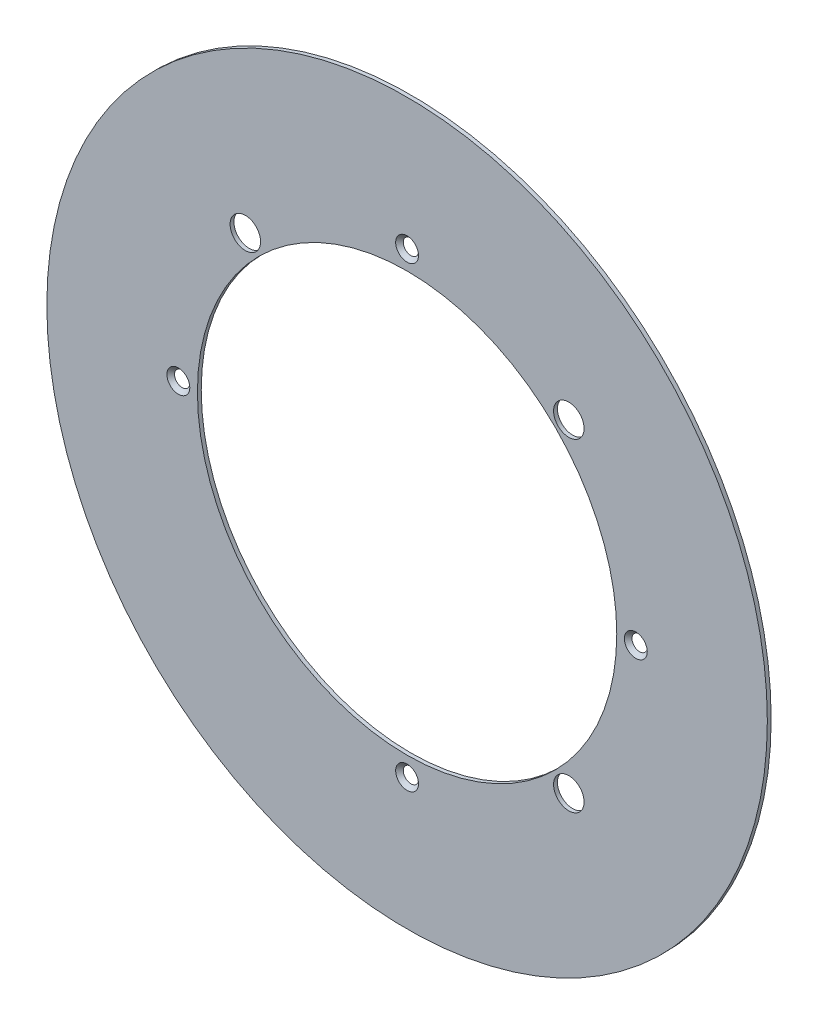
ISO-10303-21;
HEADER;
FILE_DESCRIPTION(('STEP AP214'),'2;1');
FILE_NAME('part.step','',(''),(''),'','','');
FILE_SCHEMA(('AUTOMOTIVE_DESIGN { 1 0 10303 214 1 1 1 1 }'));
ENDSEC;
DATA;
#1=APPLICATION_CONTEXT('core data for automotive mechanical design processes');
#2=APPLICATION_PROTOCOL_DEFINITION('international standard','automotive_design',2000,#1);
#3=PRODUCT_CONTEXT('',#1,'mechanical');
#4=PRODUCT('Part','Part','',(#3));
#5=PRODUCT_RELATED_PRODUCT_CATEGORY('part','',(#4));
#6=PRODUCT_DEFINITION_FORMATION('','',#4);
#7=PRODUCT_DEFINITION_CONTEXT('part definition',#1,'design');
#8=PRODUCT_DEFINITION('design','',#6,#7);
#9=PRODUCT_DEFINITION_SHAPE('','',#8);
#10=(LENGTH_UNIT() NAMED_UNIT(*) SI_UNIT(.MILLI.,.METRE.));
#11=(NAMED_UNIT(*) PLANE_ANGLE_UNIT() SI_UNIT($,.RADIAN.));
#12=(NAMED_UNIT(*) SI_UNIT($,.STERADIAN.) SOLID_ANGLE_UNIT());
#13=UNCERTAINTY_MEASURE_WITH_UNIT(LENGTH_MEASURE(1.E-05),#10,'distance_accuracy_value','');
#14=(GEOMETRIC_REPRESENTATION_CONTEXT(3) GLOBAL_UNCERTAINTY_ASSIGNED_CONTEXT((#13)) GLOBAL_UNIT_ASSIGNED_CONTEXT((#10,
#11,#12)) REPRESENTATION_CONTEXT('',''));
#15=CARTESIAN_POINT('',(0.,0.,0.));
#16=DIRECTION('',(0.,0.,1.));
#17=DIRECTION('',(1.,0.,0.));
#18=AXIS2_PLACEMENT_3D('',#15,#16,#17);
#19=CARTESIAN_POINT('',(0.,0.,1.));
#20=DIRECTION('',(0.,0.,1.));
#21=DIRECTION('',(1.,0.,0.));
#22=AXIS2_PLACEMENT_3D('',#19,#20,#21);
#23=PLANE('',#22);
#24=CARTESIAN_POINT('',(0.,60.,1.));
#25=DIRECTION('',(0.,0.,1.));
#26=DIRECTION('',(1.,0.,0.));
#27=AXIS2_PLACEMENT_3D('',#24,#25,#26);
#28=CIRCLE('',#27,3.);
#29=CARTESIAN_POINT('',(3.,60.,1.));
#30=VERTEX_POINT('',#29);
#31=EDGE_CURVE('E90',#30,#30,#28,.T.);
#32=ORIENTED_EDGE('',*,*,#31,.F.);
#33=EDGE_LOOP('',(#32));
#34=FACE_BOUND('',#33,.T.);
#35=CARTESIAN_POINT('',(60.,0.,1.));
#36=DIRECTION('',(0.,0.,1.));
#37=DIRECTION('',(1.,0.,0.));
#38=AXIS2_PLACEMENT_3D('',#35,#36,#37);
#39=CIRCLE('',#38,3.);
#40=CARTESIAN_POINT('',(63.,0.,1.));
#41=VERTEX_POINT('',#40);
#42=EDGE_CURVE('E84',#41,#41,#39,.T.);
#43=ORIENTED_EDGE('',*,*,#42,.F.);
#44=EDGE_LOOP('',(#43));
#45=FACE_BOUND('',#44,.T.);
#46=CARTESIAN_POINT('',(0.,-60.,1.));
#47=DIRECTION('',(0.,0.,1.));
#48=DIRECTION('',(1.,0.,0.));
#49=AXIS2_PLACEMENT_3D('',#46,#47,#48);
#50=CIRCLE('',#49,3.);
#51=CARTESIAN_POINT('',(3.,-60.,1.));
#52=VERTEX_POINT('',#51);
#53=EDGE_CURVE('E78',#52,#52,#50,.T.);
#54=ORIENTED_EDGE('',*,*,#53,.F.);
#55=EDGE_LOOP('',(#54));
#56=FACE_BOUND('',#55,.T.);
#57=CARTESIAN_POINT('',(-60.,0.,1.));
#58=DIRECTION('',(0.,0.,1.));
#59=DIRECTION('',(1.,0.,0.));
#60=AXIS2_PLACEMENT_3D('',#57,#58,#59);
#61=CIRCLE('',#60,3.);
#62=CARTESIAN_POINT('',(-57.,0.,1.));
#63=VERTEX_POINT('',#62);
#64=EDGE_CURVE('E72',#63,#63,#61,.T.);
#65=ORIENTED_EDGE('',*,*,#64,.F.);
#66=EDGE_LOOP('',(#65));
#67=FACE_BOUND('',#66,.T.);
#68=CARTESIAN_POINT('',(42.4264068711929,-42.4264068711928,1.));
#69=DIRECTION('',(0.,0.,1.));
#70=DIRECTION('',(1.,0.,0.));
#71=AXIS2_PLACEMENT_3D('',#68,#69,#70);
#72=CIRCLE('',#71,4.00000000000001);
#73=CARTESIAN_POINT('',(46.4264068711929,-42.4264068711928,1.));
#74=VERTEX_POINT('',#73);
#75=EDGE_CURVE('E66',#74,#74,#72,.T.);
#76=ORIENTED_EDGE('',*,*,#75,.F.);
#77=EDGE_LOOP('',(#76));
#78=FACE_BOUND('',#77,.T.);
#79=CARTESIAN_POINT('',(-42.426406871193,42.4264068711927,1.));
#80=DIRECTION('',(0.,0.,1.));
#81=DIRECTION('',(1.,0.,0.));
#82=AXIS2_PLACEMENT_3D('',#79,#80,#81);
#83=CIRCLE('',#82,4.00000000000001);
#84=CARTESIAN_POINT('',(-38.4264068711929,42.4264068711927,1.));
#85=VERTEX_POINT('',#84);
#86=EDGE_CURVE('E60',#85,#85,#83,.T.);
#87=ORIENTED_EDGE('',*,*,#86,.F.);
#88=EDGE_LOOP('',(#87));
#89=FACE_BOUND('',#88,.T.);
#90=CARTESIAN_POINT('',(42.4264068711929,42.4264068711928,1.));
#91=DIRECTION('',(0.,0.,1.));
#92=DIRECTION('',(1.,0.,0.));
#93=AXIS2_PLACEMENT_3D('',#90,#91,#92);
#94=CIRCLE('',#93,4.);
#95=CARTESIAN_POINT('',(46.4264068711929,42.4264068711928,1.));
#96=VERTEX_POINT('',#95);
#97=EDGE_CURVE('E54',#96,#96,#94,.T.);
#98=ORIENTED_EDGE('',*,*,#97,.F.);
#99=EDGE_LOOP('',(#98));
#100=FACE_BOUND('',#99,.T.);
#101=CARTESIAN_POINT('',(0.,0.,1.));
#102=DIRECTION('',(0.,0.,1.));
#103=DIRECTION('',(1.,0.,0.));
#104=AXIS2_PLACEMENT_3D('',#101,#102,#103);
#105=CIRCLE('',#104,94.5);
#106=CARTESIAN_POINT('',(94.5,0.,1.));
#107=VERTEX_POINT('',#106);
#108=EDGE_CURVE('E10',#107,#107,#105,.T.);
#109=ORIENTED_EDGE('',*,*,#108,.T.);
#110=EDGE_LOOP('',(#109));
#111=FACE_BOUND('',#110,.T.);
#112=CARTESIAN_POINT('',(0.,0.,1.));
#113=DIRECTION('',(0.,0.,1.));
#114=DIRECTION('',(1.,0.,0.));
#115=AXIS2_PLACEMENT_3D('',#112,#113,#114);
#116=CIRCLE('',#115,55.);
#117=CARTESIAN_POINT('',(55.,0.,1.));
#118=VERTEX_POINT('',#117);
#119=EDGE_CURVE('E44',#118,#118,#116,.T.);
#120=ORIENTED_EDGE('',*,*,#119,.F.);
#121=EDGE_LOOP('',(#120));
#122=FACE_BOUND('',#121,.T.);
#123=ADVANCED_FACE('F33',(#34,#45,#56,#67,#78,#89,#100,#111,#122),#23,.T.);
#124=CARTESIAN_POINT('',(0.,0.,0.));
#125=DIRECTION('',(0.,0.,1.));
#126=DIRECTION('',(1.,0.,0.));
#127=AXIS2_PLACEMENT_3D('',#124,#125,#126);
#128=PLANE('',#127);
#129=CARTESIAN_POINT('',(0.,60.,0.));
#130=DIRECTION('',(0.,0.,1.));
#131=DIRECTION('',(1.,0.,0.));
#132=AXIS2_PLACEMENT_3D('',#129,#130,#131);
#133=CIRCLE('',#132,2.);
#134=CARTESIAN_POINT('',(2.,60.,0.));
#135=VERTEX_POINT('',#134);
#136=EDGE_CURVE('E87',#135,#135,#133,.T.);
#137=ORIENTED_EDGE('',*,*,#136,.T.);
#138=EDGE_LOOP('',(#137));
#139=FACE_BOUND('',#138,.T.);
#140=CARTESIAN_POINT('',(60.,0.,0.));
#141=DIRECTION('',(0.,0.,1.));
#142=DIRECTION('',(1.,0.,0.));
#143=AXIS2_PLACEMENT_3D('',#140,#141,#142);
#144=CIRCLE('',#143,2.);
#145=CARTESIAN_POINT('',(62.,0.,0.));
#146=VERTEX_POINT('',#145);
#147=EDGE_CURVE('E81',#146,#146,#144,.T.);
#148=ORIENTED_EDGE('',*,*,#147,.T.);
#149=EDGE_LOOP('',(#148));
#150=FACE_BOUND('',#149,.T.);
#151=CARTESIAN_POINT('',(0.,-60.,0.));
#152=DIRECTION('',(0.,0.,1.));
#153=DIRECTION('',(1.,0.,0.));
#154=AXIS2_PLACEMENT_3D('',#151,#152,#153);
#155=CIRCLE('',#154,2.);
#156=CARTESIAN_POINT('',(2.,-60.,0.));
#157=VERTEX_POINT('',#156);
#158=EDGE_CURVE('E75',#157,#157,#155,.T.);
#159=ORIENTED_EDGE('',*,*,#158,.T.);
#160=EDGE_LOOP('',(#159));
#161=FACE_BOUND('',#160,.T.);
#162=CARTESIAN_POINT('',(-60.,0.,0.));
#163=DIRECTION('',(0.,0.,1.));
#164=DIRECTION('',(1.,0.,0.));
#165=AXIS2_PLACEMENT_3D('',#162,#163,#164);
#166=CIRCLE('',#165,2.);
#167=CARTESIAN_POINT('',(-58.,0.,0.));
#168=VERTEX_POINT('',#167);
#169=EDGE_CURVE('E69',#168,#168,#166,.T.);
#170=ORIENTED_EDGE('',*,*,#169,.T.);
#171=EDGE_LOOP('',(#170));
#172=FACE_BOUND('',#171,.T.);
#173=CARTESIAN_POINT('',(42.4264068711929,-42.4264068711928,0.));
#174=DIRECTION('',(0.,0.,1.));
#175=DIRECTION('',(1.,0.,0.));
#176=AXIS2_PLACEMENT_3D('',#173,#174,#175);
#177=CIRCLE('',#176,4.00000000000001);
#178=CARTESIAN_POINT('',(46.4264068711929,-42.4264068711928,0.));
#179=VERTEX_POINT('',#178);
#180=EDGE_CURVE('E63',#179,#179,#177,.F.);
#181=ORIENTED_EDGE('',*,*,#180,.F.);
#182=EDGE_LOOP('',(#181));
#183=FACE_BOUND('',#182,.T.);
#184=CARTESIAN_POINT('',(-42.426406871193,42.4264068711927,0.));
#185=DIRECTION('',(0.,0.,1.));
#186=DIRECTION('',(1.,0.,0.));
#187=AXIS2_PLACEMENT_3D('',#184,#185,#186);
#188=CIRCLE('',#187,4.00000000000001);
#189=CARTESIAN_POINT('',(-38.4264068711929,42.4264068711927,0.));
#190=VERTEX_POINT('',#189);
#191=EDGE_CURVE('E57',#190,#190,#188,.F.);
#192=ORIENTED_EDGE('',*,*,#191,.F.);
#193=EDGE_LOOP('',(#192));
#194=FACE_BOUND('',#193,.T.);
#195=CARTESIAN_POINT('',(42.4264068711929,42.4264068711928,0.));
#196=DIRECTION('',(0.,0.,1.));
#197=DIRECTION('',(1.,0.,0.));
#198=AXIS2_PLACEMENT_3D('',#195,#196,#197);
#199=CIRCLE('',#198,4.);
#200=CARTESIAN_POINT('',(46.4264068711929,42.4264068711928,0.));
#201=VERTEX_POINT('',#200);
#202=EDGE_CURVE('E49',#201,#201,#199,.F.);
#203=ORIENTED_EDGE('',*,*,#202,.F.);
#204=EDGE_LOOP('',(#203));
#205=FACE_BOUND('',#204,.T.);
#206=CARTESIAN_POINT('',(0.,0.,0.));
#207=DIRECTION('',(0.,0.,1.));
#208=DIRECTION('',(1.,0.,0.));
#209=AXIS2_PLACEMENT_3D('',#206,#207,#208);
#210=CIRCLE('',#209,94.5);
#211=CARTESIAN_POINT('',(94.5,0.,0.));
#212=VERTEX_POINT('',#211);
#213=EDGE_CURVE('E37',#212,#212,#210,.T.);
#214=ORIENTED_EDGE('',*,*,#213,.F.);
#215=EDGE_LOOP('',(#214));
#216=FACE_BOUND('',#215,.T.);
#217=CARTESIAN_POINT('',(0.,0.,0.));
#218=DIRECTION('',(0.,0.,1.));
#219=DIRECTION('',(1.,0.,0.));
#220=AXIS2_PLACEMENT_3D('',#217,#218,#219);
#221=CIRCLE('',#220,55.);
#222=CARTESIAN_POINT('',(55.,0.,0.));
#223=VERTEX_POINT('',#222);
#224=EDGE_CURVE('E46',#223,#223,#221,.T.);
#225=ORIENTED_EDGE('',*,*,#224,.T.);
#226=EDGE_LOOP('',(#225));
#227=FACE_BOUND('',#226,.T.);
#228=ADVANCED_FACE('F98',(#139,#150,#161,#172,#183,#194,#205,#216,#227),#128,.F.);
#229=CARTESIAN_POINT('',(0.,0.,1.));
#230=DIRECTION('',(0.,0.,-1.));
#231=DIRECTION('',(-1.,0.,0.));
#232=AXIS2_PLACEMENT_3D('',#229,#230,#231);
#233=CYLINDRICAL_SURFACE('',#232,94.5);
#234=ORIENTED_EDGE('',*,*,#108,.F.);
#235=EDGE_LOOP('',(#234));
#236=FACE_BOUND('',#235,.T.);
#237=ORIENTED_EDGE('',*,*,#213,.T.);
#238=EDGE_LOOP('',(#237));
#239=FACE_BOUND('',#238,.T.);
#240=ADVANCED_FACE('F35',(#236,#239),#233,.T.);
#241=CARTESIAN_POINT('',(0.,0.,1.));
#242=DIRECTION('',(0.,0.,-1.));
#243=DIRECTION('',(-1.,0.,0.));
#244=AXIS2_PLACEMENT_3D('',#241,#242,#243);
#245=CYLINDRICAL_SURFACE('',#244,55.);
#246=ORIENTED_EDGE('',*,*,#119,.T.);
#247=EDGE_LOOP('',(#246));
#248=FACE_BOUND('',#247,.T.);
#249=ORIENTED_EDGE('',*,*,#224,.F.);
#250=EDGE_LOOP('',(#249));
#251=FACE_BOUND('',#250,.T.);
#252=ADVANCED_FACE('F114',(#248,#251),#245,.F.);
#253=CARTESIAN_POINT('',(42.4264068711929,42.4264068711928,-0.000999999999999916));
#254=DIRECTION('',(0.,0.,1.));
#255=DIRECTION('',(1.,0.,0.));
#256=AXIS2_PLACEMENT_3D('',#253,#254,#255);
#257=CYLINDRICAL_SURFACE('',#256,4.);
#258=ORIENTED_EDGE('',*,*,#97,.T.);
#259=EDGE_LOOP('',(#258));
#260=FACE_BOUND('',#259,.T.);
#261=ORIENTED_EDGE('',*,*,#202,.T.);
#262=EDGE_LOOP('',(#261));
#263=FACE_BOUND('',#262,.T.);
#264=ADVANCED_FACE('F117',(#260,#263),#257,.F.);
#265=CARTESIAN_POINT('',(-42.426406871193,42.4264068711927,-0.000999999999999916));
#266=DIRECTION('',(0.,0.,1.));
#267=DIRECTION('',(1.,0.,0.));
#268=AXIS2_PLACEMENT_3D('',#265,#266,#267);
#269=CYLINDRICAL_SURFACE('',#268,4.00000000000001);
#270=ORIENTED_EDGE('',*,*,#86,.T.);
#271=EDGE_LOOP('',(#270));
#272=FACE_BOUND('',#271,.T.);
#273=ORIENTED_EDGE('',*,*,#191,.T.);
#274=EDGE_LOOP('',(#273));
#275=FACE_BOUND('',#274,.T.);
#276=ADVANCED_FACE('F131',(#272,#275),#269,.F.);
#277=CARTESIAN_POINT('',(42.4264068711929,-42.4264068711928,-0.000999999999999916));
#278=DIRECTION('',(0.,0.,1.));
#279=DIRECTION('',(1.,0.,0.));
#280=AXIS2_PLACEMENT_3D('',#277,#278,#279);
#281=CYLINDRICAL_SURFACE('',#280,4.00000000000001);
#282=ORIENTED_EDGE('',*,*,#75,.T.);
#283=EDGE_LOOP('',(#282));
#284=FACE_BOUND('',#283,.T.);
#285=ORIENTED_EDGE('',*,*,#180,.T.);
#286=EDGE_LOOP('',(#285));
#287=FACE_BOUND('',#286,.T.);
#288=ADVANCED_FACE('F135',(#284,#287),#281,.F.);
#289=CARTESIAN_POINT('',(-60.,0.,1.));
#290=DIRECTION('',(0.,0.,1.));
#291=DIRECTION('',(1.,0.,0.));
#292=AXIS2_PLACEMENT_3D('',#289,#290,#291);
#293=CONICAL_SURFACE('',#292,3.,0.78539816339745);
#294=ORIENTED_EDGE('',*,*,#169,.F.);
#295=EDGE_LOOP('',(#294));
#296=FACE_BOUND('',#295,.T.);
#297=ORIENTED_EDGE('',*,*,#64,.T.);
#298=EDGE_LOOP('',(#297));
#299=FACE_BOUND('',#298,.T.);
#300=ADVANCED_FACE('F139',(#296,#299),#293,.F.);
#301=CARTESIAN_POINT('',(0.,-60.,1.));
#302=DIRECTION('',(0.,0.,1.));
#303=DIRECTION('',(1.,0.,0.));
#304=AXIS2_PLACEMENT_3D('',#301,#302,#303);
#305=CONICAL_SURFACE('',#304,3.,0.785398163397448);
#306=ORIENTED_EDGE('',*,*,#158,.F.);
#307=EDGE_LOOP('',(#306));
#308=FACE_BOUND('',#307,.T.);
#309=ORIENTED_EDGE('',*,*,#53,.T.);
#310=EDGE_LOOP('',(#309));
#311=FACE_BOUND('',#310,.T.);
#312=ADVANCED_FACE('F143',(#308,#311),#305,.F.);
#313=CARTESIAN_POINT('',(60.,0.,1.));
#314=DIRECTION('',(0.,0.,1.));
#315=DIRECTION('',(1.,0.,0.));
#316=AXIS2_PLACEMENT_3D('',#313,#314,#315);
#317=CONICAL_SURFACE('',#316,3.,0.78539816339745);
#318=ORIENTED_EDGE('',*,*,#147,.F.);
#319=EDGE_LOOP('',(#318));
#320=FACE_BOUND('',#319,.T.);
#321=ORIENTED_EDGE('',*,*,#42,.T.);
#322=EDGE_LOOP('',(#321));
#323=FACE_BOUND('',#322,.T.);
#324=ADVANCED_FACE('F147',(#320,#323),#317,.F.);
#325=CARTESIAN_POINT('',(0.,60.,1.));
#326=DIRECTION('',(0.,0.,1.));
#327=DIRECTION('',(1.,0.,0.));
#328=AXIS2_PLACEMENT_3D('',#325,#326,#327);
#329=CONICAL_SURFACE('',#328,3.,0.785398163397448);
#330=ORIENTED_EDGE('',*,*,#136,.F.);
#331=EDGE_LOOP('',(#330));
#332=FACE_BOUND('',#331,.T.);
#333=ORIENTED_EDGE('',*,*,#31,.T.);
#334=EDGE_LOOP('',(#333));
#335=FACE_BOUND('',#334,.T.);
#336=ADVANCED_FACE('F94',(#332,#335),#329,.F.);
#337=CLOSED_SHELL('',(#123,#228,#240,#252,#264,#276,#288,#300,#312,#324,#336));
#338=MANIFOLD_SOLID_BREP('B2',#337);
#339=ADVANCED_BREP_SHAPE_REPRESENTATION('',(#18,#338),#14);
#340=SHAPE_DEFINITION_REPRESENTATION(#9,#339);
ENDSEC;
END-ISO-10303-21;
